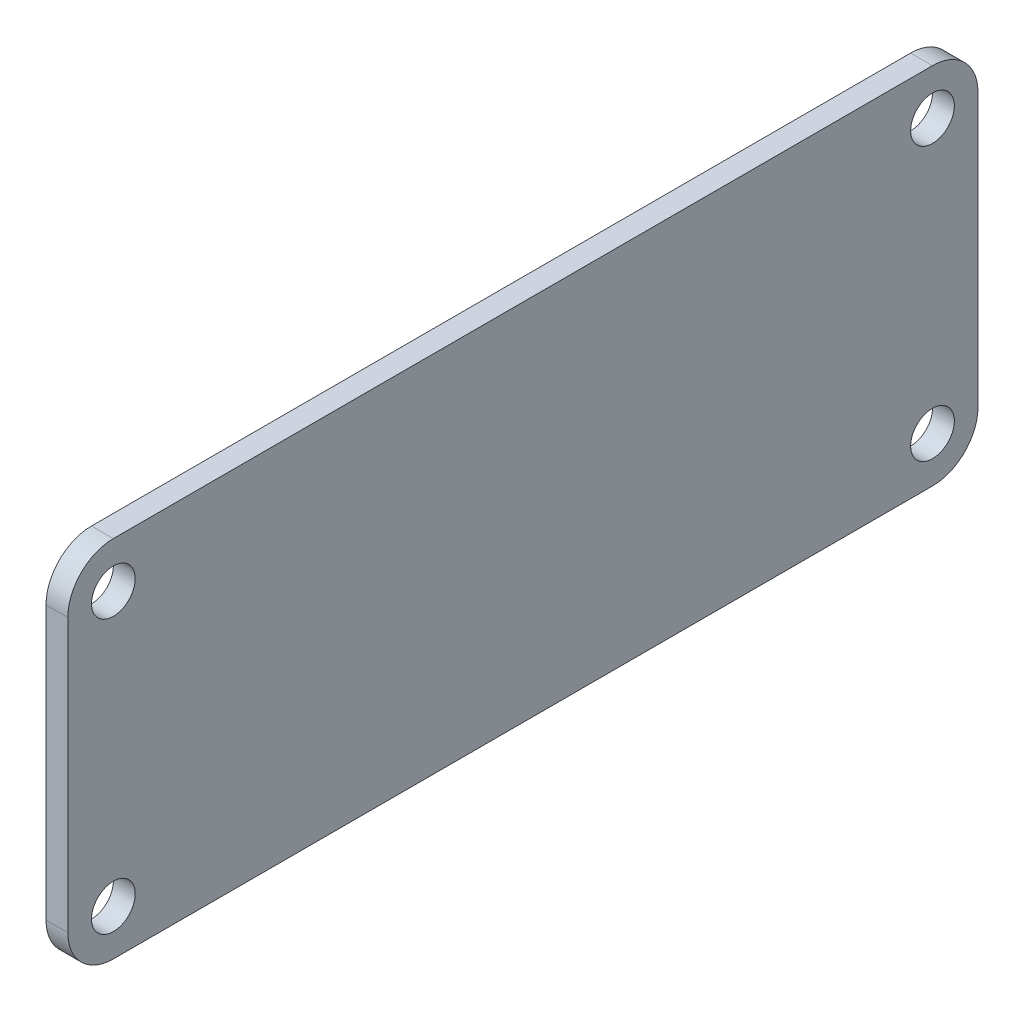
ISO-10303-21;
HEADER;
FILE_DESCRIPTION(('STEP AP214'),'2;1');
FILE_NAME('part.step','',(''),(''),'','','');
FILE_SCHEMA(('AUTOMOTIVE_DESIGN { 1 0 10303 214 1 1 1 1 }'));
ENDSEC;
DATA;
#1=APPLICATION_CONTEXT('core data for automotive mechanical design processes');
#2=APPLICATION_PROTOCOL_DEFINITION('international standard','automotive_design',2000,#1);
#3=PRODUCT_CONTEXT('',#1,'mechanical');
#4=PRODUCT('Part','Part','',(#3));
#5=PRODUCT_RELATED_PRODUCT_CATEGORY('part','',(#4));
#6=PRODUCT_DEFINITION_FORMATION('','',#4);
#7=PRODUCT_DEFINITION_CONTEXT('part definition',#1,'design');
#8=PRODUCT_DEFINITION('design','',#6,#7);
#9=PRODUCT_DEFINITION_SHAPE('','',#8);
#10=(LENGTH_UNIT() NAMED_UNIT(*) SI_UNIT(.MILLI.,.METRE.));
#11=(NAMED_UNIT(*) PLANE_ANGLE_UNIT() SI_UNIT($,.RADIAN.));
#12=(NAMED_UNIT(*) SI_UNIT($,.STERADIAN.) SOLID_ANGLE_UNIT());
#13=UNCERTAINTY_MEASURE_WITH_UNIT(LENGTH_MEASURE(1.E-05),#10,'distance_accuracy_value','');
#14=(GEOMETRIC_REPRESENTATION_CONTEXT(3) GLOBAL_UNCERTAINTY_ASSIGNED_CONTEXT((#13)) GLOBAL_UNIT_ASSIGNED_CONTEXT((#10,
#11,#12)) REPRESENTATION_CONTEXT('',''));
#15=CARTESIAN_POINT('',(0.,0.,0.));
#16=DIRECTION('',(0.,0.,1.));
#17=DIRECTION('',(1.,0.,0.));
#18=AXIS2_PLACEMENT_3D('',#15,#16,#17);
#19=CARTESIAN_POINT('',(1.524,-9.525,28.575));
#20=DIRECTION('',(-1.,0.,0.));
#21=DIRECTION('',(0.,0.,1.));
#22=AXIS2_PLACEMENT_3D('',#19,#20,#21);
#23=PLANE('',#22);
#24=CARTESIAN_POINT('',(1.524,-9.525,-28.575));
#25=DIRECTION('',(1.,0.,0.));
#26=DIRECTION('',(0.,0.,-1.));
#27=AXIS2_PLACEMENT_3D('',#24,#25,#26);
#28=CIRCLE('',#27,1.524);
#29=CARTESIAN_POINT('',(1.524,-9.525,-27.051));
#30=VERTEX_POINT('',#29);
#31=EDGE_CURVE('E188',#30,#30,#28,.T.);
#32=ORIENTED_EDGE('',*,*,#31,.F.);
#33=EDGE_LOOP('',(#32));
#34=FACE_BOUND('',#33,.T.);
#35=CARTESIAN_POINT('',(1.524,9.525,28.575));
#36=DIRECTION('',(1.,0.,0.));
#37=DIRECTION('',(0.,0.,-1.));
#38=AXIS2_PLACEMENT_3D('',#35,#36,#37);
#39=CIRCLE('',#38,1.524);
#40=CARTESIAN_POINT('',(1.524,9.525,30.099));
#41=VERTEX_POINT('',#40);
#42=EDGE_CURVE('E134',#41,#41,#39,.T.);
#43=ORIENTED_EDGE('',*,*,#42,.F.);
#44=EDGE_LOOP('',(#43));
#45=FACE_BOUND('',#44,.T.);
#46=CARTESIAN_POINT('',(1.524,-9.525,28.575));
#47=DIRECTION('',(1.,0.,0.));
#48=DIRECTION('',(0.,0.,1.));
#49=AXIS2_PLACEMENT_3D('',#46,#47,#48);
#50=CIRCLE('',#49,3.175);
#51=CARTESIAN_POINT('',(1.524,-9.52499999999998,31.75));
#52=VERTEX_POINT('',#51);
#53=CARTESIAN_POINT('',(1.524,-12.7,28.575));
#54=VERTEX_POINT('',#53);
#55=EDGE_CURVE('E145',#52,#54,#50,.T.);
#56=ORIENTED_EDGE('',*,*,#55,.T.);
#57=DIRECTION('',(0.,0.,-1.));
#58=VECTOR('',#57,1.);
#59=CARTESIAN_POINT('',(1.524,-12.7,28.575));
#60=LINE('',#59,#58);
#61=CARTESIAN_POINT('',(1.524,-12.7,-28.575));
#62=VERTEX_POINT('',#61);
#63=EDGE_CURVE('E93',#54,#62,#60,.T.);
#64=ORIENTED_EDGE('',*,*,#63,.T.);
#65=CARTESIAN_POINT('',(1.524,-9.525,-28.575));
#66=DIRECTION('',(1.,0.,0.));
#67=DIRECTION('',(0.,0.,-1.));
#68=AXIS2_PLACEMENT_3D('',#65,#66,#67);
#69=CIRCLE('',#68,3.175);
#70=CARTESIAN_POINT('',(1.524,-9.52499999999998,-31.75));
#71=VERTEX_POINT('',#70);
#72=EDGE_CURVE('E160',#62,#71,#69,.T.);
#73=ORIENTED_EDGE('',*,*,#72,.T.);
#74=DIRECTION('',(0.,1.,0.));
#75=VECTOR('',#74,1.);
#76=CARTESIAN_POINT('',(1.524,-9.52499999999998,-31.75));
#77=LINE('',#76,#75);
#78=CARTESIAN_POINT('',(1.524,9.52499999999997,-31.75));
#79=VERTEX_POINT('',#78);
#80=EDGE_CURVE('E173',#71,#79,#77,.T.);
#81=ORIENTED_EDGE('',*,*,#80,.T.);
#82=CARTESIAN_POINT('',(1.524,9.525,-28.575));
#83=DIRECTION('',(1.,0.,0.));
#84=DIRECTION('',(0.,0.,1.));
#85=AXIS2_PLACEMENT_3D('',#82,#83,#84);
#86=CIRCLE('',#85,3.175);
#87=CARTESIAN_POINT('',(1.524,12.7,-28.575));
#88=VERTEX_POINT('',#87);
#89=EDGE_CURVE('E112',#79,#88,#86,.T.);
#90=ORIENTED_EDGE('',*,*,#89,.T.);
#91=DIRECTION('',(0.,0.,1.));
#92=VECTOR('',#91,1.);
#93=CARTESIAN_POINT('',(1.524,12.7,28.575));
#94=LINE('',#93,#92);
#95=CARTESIAN_POINT('',(1.524,12.7,28.575));
#96=VERTEX_POINT('',#95);
#97=EDGE_CURVE('E106',#88,#96,#94,.T.);
#98=ORIENTED_EDGE('',*,*,#97,.T.);
#99=CARTESIAN_POINT('',(1.524,9.525,28.575));
#100=DIRECTION('',(1.,0.,0.));
#101=DIRECTION('',(0.,0.,1.));
#102=AXIS2_PLACEMENT_3D('',#99,#100,#101);
#103=CIRCLE('',#102,3.175);
#104=CARTESIAN_POINT('',(1.524,9.52499999999998,31.75));
#105=VERTEX_POINT('',#104);
#106=EDGE_CURVE('E110',#96,#105,#103,.T.);
#107=ORIENTED_EDGE('',*,*,#106,.T.);
#108=DIRECTION('',(0.,-1.,0.));
#109=VECTOR('',#108,1.);
#110=CARTESIAN_POINT('',(1.524,-9.52499999999998,31.75));
#111=LINE('',#110,#109);
#112=EDGE_CURVE('E50',#105,#52,#111,.T.);
#113=ORIENTED_EDGE('',*,*,#112,.T.);
#114=EDGE_LOOP('',(#56,#64,#73,#81,#90,#98,#107,#113));
#115=FACE_BOUND('',#114,.T.);
#116=CARTESIAN_POINT('',(1.524,9.525,-28.575));
#117=DIRECTION('',(1.,0.,0.));
#118=DIRECTION('',(0.,0.,-1.));
#119=AXIS2_PLACEMENT_3D('',#116,#117,#118);
#120=CIRCLE('',#119,1.524);
#121=CARTESIAN_POINT('',(1.524,9.525,-27.051));
#122=VERTEX_POINT('',#121);
#123=EDGE_CURVE('E182',#122,#122,#120,.T.);
#124=ORIENTED_EDGE('',*,*,#123,.F.);
#125=EDGE_LOOP('',(#124));
#126=FACE_BOUND('',#125,.T.);
#127=CARTESIAN_POINT('',(1.524,-9.525,28.575));
#128=DIRECTION('',(1.,0.,0.));
#129=DIRECTION('',(0.,0.,-1.));
#130=AXIS2_PLACEMENT_3D('',#127,#128,#129);
#131=CIRCLE('',#130,1.524);
#132=CARTESIAN_POINT('',(1.524,-9.525,30.099));
#133=VERTEX_POINT('',#132);
#134=EDGE_CURVE('E194',#133,#133,#131,.T.);
#135=ORIENTED_EDGE('',*,*,#134,.F.);
#136=EDGE_LOOP('',(#135));
#137=FACE_BOUND('',#136,.T.);
#138=ADVANCED_FACE('F33',(#34,#45,#115,#126,#137),#23,.F.);
#139=CARTESIAN_POINT('',(0.,-9.525,28.575));
#140=DIRECTION('',(-1.,0.,0.));
#141=DIRECTION('',(0.,0.,1.));
#142=AXIS2_PLACEMENT_3D('',#139,#140,#141);
#143=PLANE('',#142);
#144=CARTESIAN_POINT('',(0.,-9.525,-28.575));
#145=DIRECTION('',(1.,0.,0.));
#146=DIRECTION('',(0.,0.,-1.));
#147=AXIS2_PLACEMENT_3D('',#144,#145,#146);
#148=CIRCLE('',#147,1.524);
#149=CARTESIAN_POINT('',(0.,-9.525,-27.051));
#150=VERTEX_POINT('',#149);
#151=EDGE_CURVE('E191',#150,#150,#148,.T.);
#152=ORIENTED_EDGE('',*,*,#151,.T.);
#153=EDGE_LOOP('',(#152));
#154=FACE_BOUND('',#153,.T.);
#155=CARTESIAN_POINT('',(0.,9.525,28.575));
#156=DIRECTION('',(1.,0.,0.));
#157=DIRECTION('',(0.,0.,-1.));
#158=AXIS2_PLACEMENT_3D('',#155,#156,#157);
#159=CIRCLE('',#158,1.524);
#160=CARTESIAN_POINT('',(0.,9.525,30.099));
#161=VERTEX_POINT('',#160);
#162=EDGE_CURVE('E179',#161,#161,#159,.T.);
#163=ORIENTED_EDGE('',*,*,#162,.T.);
#164=EDGE_LOOP('',(#163));
#165=FACE_BOUND('',#164,.T.);
#166=CARTESIAN_POINT('',(0.,-9.525,28.575));
#167=DIRECTION('',(1.,0.,0.));
#168=DIRECTION('',(0.,0.,1.));
#169=AXIS2_PLACEMENT_3D('',#166,#167,#168);
#170=CIRCLE('',#169,3.175);
#171=CARTESIAN_POINT('',(0.,-9.52499999999998,31.75));
#172=VERTEX_POINT('',#171);
#173=CARTESIAN_POINT('',(0.,-12.7,28.575));
#174=VERTEX_POINT('',#173);
#175=EDGE_CURVE('E130',#172,#174,#170,.T.);
#176=ORIENTED_EDGE('',*,*,#175,.F.);
#177=DIRECTION('',(0.,-1.,0.));
#178=VECTOR('',#177,1.);
#179=CARTESIAN_POINT('',(0.,-9.52499999999998,31.75));
#180=LINE('',#179,#178);
#181=CARTESIAN_POINT('',(0.,9.52499999999998,31.75));
#182=VERTEX_POINT('',#181);
#183=EDGE_CURVE('E85',#182,#172,#180,.T.);
#184=ORIENTED_EDGE('',*,*,#183,.F.);
#185=CARTESIAN_POINT('',(0.,9.525,28.575));
#186=DIRECTION('',(1.,0.,0.));
#187=DIRECTION('',(0.,0.,1.));
#188=AXIS2_PLACEMENT_3D('',#185,#186,#187);
#189=CIRCLE('',#188,3.175);
#190=CARTESIAN_POINT('',(0.,12.7,28.575));
#191=VERTEX_POINT('',#190);
#192=EDGE_CURVE('E79',#191,#182,#189,.T.);
#193=ORIENTED_EDGE('',*,*,#192,.F.);
#194=DIRECTION('',(0.,0.,1.));
#195=VECTOR('',#194,1.);
#196=CARTESIAN_POINT('',(0.,12.7,28.575));
#197=LINE('',#196,#195);
#198=CARTESIAN_POINT('',(0.,12.7,-28.575));
#199=VERTEX_POINT('',#198);
#200=EDGE_CURVE('E120',#199,#191,#197,.T.);
#201=ORIENTED_EDGE('',*,*,#200,.F.);
#202=CARTESIAN_POINT('',(0.,9.525,-28.575));
#203=DIRECTION('',(1.,0.,0.));
#204=DIRECTION('',(0.,0.,1.));
#205=AXIS2_PLACEMENT_3D('',#202,#203,#204);
#206=CIRCLE('',#205,3.175);
#207=CARTESIAN_POINT('',(0.,9.52499999999997,-31.75));
#208=VERTEX_POINT('',#207);
#209=EDGE_CURVE('E140',#208,#199,#206,.T.);
#210=ORIENTED_EDGE('',*,*,#209,.F.);
#211=DIRECTION('',(0.,1.,0.));
#212=VECTOR('',#211,1.);
#213=CARTESIAN_POINT('',(0.,-9.52499999999998,-31.75));
#214=LINE('',#213,#212);
#215=CARTESIAN_POINT('',(0.,-9.52499999999998,-31.75));
#216=VERTEX_POINT('',#215);
#217=EDGE_CURVE('E138',#216,#208,#214,.T.);
#218=ORIENTED_EDGE('',*,*,#217,.F.);
#219=CARTESIAN_POINT('',(0.,-9.525,-28.575));
#220=DIRECTION('',(1.,0.,0.));
#221=DIRECTION('',(0.,0.,-1.));
#222=AXIS2_PLACEMENT_3D('',#219,#220,#221);
#223=CIRCLE('',#222,3.175);
#224=CARTESIAN_POINT('',(0.,-12.7,-28.575));
#225=VERTEX_POINT('',#224);
#226=EDGE_CURVE('E136',#225,#216,#223,.T.);
#227=ORIENTED_EDGE('',*,*,#226,.F.);
#228=DIRECTION('',(0.,0.,-1.));
#229=VECTOR('',#228,1.);
#230=CARTESIAN_POINT('',(0.,-12.7,28.575));
#231=LINE('',#230,#229);
#232=EDGE_CURVE('E133',#174,#225,#231,.T.);
#233=ORIENTED_EDGE('',*,*,#232,.F.);
#234=EDGE_LOOP('',(#176,#184,#193,#201,#210,#218,#227,#233));
#235=FACE_BOUND('',#234,.T.);
#236=CARTESIAN_POINT('',(0.,9.525,-28.575));
#237=DIRECTION('',(1.,0.,0.));
#238=DIRECTION('',(0.,0.,-1.));
#239=AXIS2_PLACEMENT_3D('',#236,#237,#238);
#240=CIRCLE('',#239,1.524);
#241=CARTESIAN_POINT('',(0.,9.525,-27.051));
#242=VERTEX_POINT('',#241);
#243=EDGE_CURVE('E185',#242,#242,#240,.T.);
#244=ORIENTED_EDGE('',*,*,#243,.T.);
#245=EDGE_LOOP('',(#244));
#246=FACE_BOUND('',#245,.T.);
#247=CARTESIAN_POINT('',(0.,-9.525,28.575));
#248=DIRECTION('',(1.,0.,0.));
#249=DIRECTION('',(0.,0.,-1.));
#250=AXIS2_PLACEMENT_3D('',#247,#248,#249);
#251=CIRCLE('',#250,1.524);
#252=CARTESIAN_POINT('',(0.,-9.525,30.099));
#253=VERTEX_POINT('',#252);
#254=EDGE_CURVE('E197',#253,#253,#251,.T.);
#255=ORIENTED_EDGE('',*,*,#254,.T.);
#256=EDGE_LOOP('',(#255));
#257=FACE_BOUND('',#256,.T.);
#258=ADVANCED_FACE('F164',(#154,#165,#235,#246,#257),#143,.T.);
#259=CARTESIAN_POINT('',(1.524,-9.525,28.575));
#260=DIRECTION('',(-1.,0.,0.));
#261=DIRECTION('',(0.,0.,1.));
#262=AXIS2_PLACEMENT_3D('',#259,#260,#261);
#263=CYLINDRICAL_SURFACE('',#262,3.175);
#264=ORIENTED_EDGE('',*,*,#175,.T.);
#265=DIRECTION('',(-1.,0.,0.));
#266=VECTOR('',#265,1.);
#267=CARTESIAN_POINT('',(1.524,-12.7,28.575));
#268=LINE('',#267,#266);
#269=EDGE_CURVE('E11',#54,#174,#268,.T.);
#270=ORIENTED_EDGE('',*,*,#269,.F.);
#271=ORIENTED_EDGE('',*,*,#55,.F.);
#272=DIRECTION('',(-1.,0.,0.));
#273=VECTOR('',#272,1.);
#274=CARTESIAN_POINT('',(1.524,-9.52499999999998,31.75));
#275=LINE('',#274,#273);
#276=EDGE_CURVE('E126',#52,#172,#275,.T.);
#277=ORIENTED_EDGE('',*,*,#276,.T.);
#278=EDGE_LOOP('',(#264,#270,#271,#277));
#279=FACE_BOUND('',#278,.T.);
#280=ADVANCED_FACE('F35',(#279),#263,.T.);
#281=CARTESIAN_POINT('',(1.524,-12.7,28.575));
#282=DIRECTION('',(0.,1.,0.));
#283=DIRECTION('',(0.,0.,1.));
#284=AXIS2_PLACEMENT_3D('',#281,#282,#283);
#285=PLANE('',#284);
#286=ORIENTED_EDGE('',*,*,#232,.T.);
#287=DIRECTION('',(-1.,0.,0.));
#288=VECTOR('',#287,1.);
#289=CARTESIAN_POINT('',(1.524,-12.7,-28.575));
#290=LINE('',#289,#288);
#291=EDGE_CURVE('E42',#62,#225,#290,.T.);
#292=ORIENTED_EDGE('',*,*,#291,.F.);
#293=ORIENTED_EDGE('',*,*,#63,.F.);
#294=ORIENTED_EDGE('',*,*,#269,.T.);
#295=EDGE_LOOP('',(#286,#292,#293,#294));
#296=FACE_BOUND('',#295,.T.);
#297=ADVANCED_FACE('F232',(#296),#285,.F.);
#298=CARTESIAN_POINT('',(1.524,-9.525,-28.575));
#299=DIRECTION('',(-1.,0.,0.));
#300=DIRECTION('',(0.,0.,1.));
#301=AXIS2_PLACEMENT_3D('',#298,#299,#300);
#302=CYLINDRICAL_SURFACE('',#301,3.175);
#303=ORIENTED_EDGE('',*,*,#226,.T.);
#304=DIRECTION('',(-1.,0.,0.));
#305=VECTOR('',#304,1.);
#306=CARTESIAN_POINT('',(1.524,-9.52499999999998,-31.75));
#307=LINE('',#306,#305);
#308=EDGE_CURVE('E152',#71,#216,#307,.T.);
#309=ORIENTED_EDGE('',*,*,#308,.F.);
#310=ORIENTED_EDGE('',*,*,#72,.F.);
#311=ORIENTED_EDGE('',*,*,#291,.T.);
#312=EDGE_LOOP('',(#303,#309,#310,#311));
#313=FACE_BOUND('',#312,.T.);
#314=ADVANCED_FACE('F158',(#313),#302,.T.);
#315=CARTESIAN_POINT('',(1.524,-9.52499999999998,-31.75));
#316=DIRECTION('',(0.,0.,1.));
#317=DIRECTION('',(1.,0.,0.));
#318=AXIS2_PLACEMENT_3D('',#315,#316,#317);
#319=PLANE('',#318);
#320=ORIENTED_EDGE('',*,*,#217,.T.);
#321=DIRECTION('',(-1.,0.,0.));
#322=VECTOR('',#321,1.);
#323=CARTESIAN_POINT('',(1.524,9.52499999999997,-31.75));
#324=LINE('',#323,#322);
#325=EDGE_CURVE('E149',#79,#208,#324,.T.);
#326=ORIENTED_EDGE('',*,*,#325,.F.);
#327=ORIENTED_EDGE('',*,*,#80,.F.);
#328=ORIENTED_EDGE('',*,*,#308,.T.);
#329=EDGE_LOOP('',(#320,#326,#327,#328));
#330=FACE_BOUND('',#329,.T.);
#331=ADVANCED_FACE('F169',(#330),#319,.F.);
#332=CARTESIAN_POINT('',(1.524,9.525,-28.575));
#333=DIRECTION('',(-1.,0.,0.));
#334=DIRECTION('',(0.,0.,1.));
#335=AXIS2_PLACEMENT_3D('',#332,#333,#334);
#336=CYLINDRICAL_SURFACE('',#335,3.175);
#337=ORIENTED_EDGE('',*,*,#209,.T.);
#338=DIRECTION('',(-1.,0.,0.));
#339=VECTOR('',#338,1.);
#340=CARTESIAN_POINT('',(1.524,12.7,-28.575));
#341=LINE('',#340,#339);
#342=EDGE_CURVE('E121',#88,#199,#341,.T.);
#343=ORIENTED_EDGE('',*,*,#342,.F.);
#344=ORIENTED_EDGE('',*,*,#89,.F.);
#345=ORIENTED_EDGE('',*,*,#325,.T.);
#346=EDGE_LOOP('',(#337,#343,#344,#345));
#347=FACE_BOUND('',#346,.T.);
#348=ADVANCED_FACE('F172',(#347),#336,.T.);
#349=CARTESIAN_POINT('',(1.524,12.7,28.575));
#350=DIRECTION('',(0.,-1.,0.));
#351=DIRECTION('',(0.,0.,-1.));
#352=AXIS2_PLACEMENT_3D('',#349,#350,#351);
#353=PLANE('',#352);
#354=ORIENTED_EDGE('',*,*,#200,.T.);
#355=DIRECTION('',(-1.,0.,0.));
#356=VECTOR('',#355,1.);
#357=CARTESIAN_POINT('',(1.524,12.7,28.575));
#358=LINE('',#357,#356);
#359=EDGE_CURVE('E117',#96,#191,#358,.T.);
#360=ORIENTED_EDGE('',*,*,#359,.F.);
#361=ORIENTED_EDGE('',*,*,#97,.F.);
#362=ORIENTED_EDGE('',*,*,#342,.T.);
#363=EDGE_LOOP('',(#354,#360,#361,#362));
#364=FACE_BOUND('',#363,.T.);
#365=ADVANCED_FACE('F118',(#364),#353,.F.);
#366=CARTESIAN_POINT('',(1.524,9.525,28.575));
#367=DIRECTION('',(-1.,0.,0.));
#368=DIRECTION('',(0.,0.,1.));
#369=AXIS2_PLACEMENT_3D('',#366,#367,#368);
#370=CYLINDRICAL_SURFACE('',#369,3.175);
#371=ORIENTED_EDGE('',*,*,#192,.T.);
#372=DIRECTION('',(-1.,0.,0.));
#373=VECTOR('',#372,1.);
#374=CARTESIAN_POINT('',(1.524,9.52499999999998,31.75));
#375=LINE('',#374,#373);
#376=EDGE_CURVE('E122',#105,#182,#375,.T.);
#377=ORIENTED_EDGE('',*,*,#376,.F.);
#378=ORIENTED_EDGE('',*,*,#106,.F.);
#379=ORIENTED_EDGE('',*,*,#359,.T.);
#380=EDGE_LOOP('',(#371,#377,#378,#379));
#381=FACE_BOUND('',#380,.T.);
#382=ADVANCED_FACE('F124',(#381),#370,.T.);
#383=CARTESIAN_POINT('',(1.524,-9.52499999999998,31.75));
#384=DIRECTION('',(0.,0.,-1.));
#385=DIRECTION('',(-1.,0.,0.));
#386=AXIS2_PLACEMENT_3D('',#383,#384,#385);
#387=PLANE('',#386);
#388=ORIENTED_EDGE('',*,*,#183,.T.);
#389=ORIENTED_EDGE('',*,*,#276,.F.);
#390=ORIENTED_EDGE('',*,*,#112,.F.);
#391=ORIENTED_EDGE('',*,*,#376,.T.);
#392=EDGE_LOOP('',(#388,#389,#390,#391));
#393=FACE_BOUND('',#392,.T.);
#394=ADVANCED_FACE('F220',(#393),#387,.F.);
#395=CARTESIAN_POINT('',(1.524,9.525,28.575));
#396=DIRECTION('',(-1.,0.,0.));
#397=DIRECTION('',(0.,0.,1.));
#398=AXIS2_PLACEMENT_3D('',#395,#396,#397);
#399=CYLINDRICAL_SURFACE('',#398,1.524);
#400=CARTESIAN_POINT('',(1.524,9.525,30.099));
#401=CARTESIAN_POINT('',(1.508125,9.525,30.099));
#402=CARTESIAN_POINT('',(1.49225,9.525,30.099));
#403=CARTESIAN_POINT('',(1.4605,9.525,30.099));
#404=CARTESIAN_POINT('',(1.444625,9.525,30.099));
#405=CARTESIAN_POINT('',(1.412875,9.525,30.099));
#406=CARTESIAN_POINT('',(1.397,9.525,30.099));
#407=CARTESIAN_POINT('',(1.36525,9.525,30.099));
#408=CARTESIAN_POINT('',(1.349375,9.525,30.099));
#409=CARTESIAN_POINT('',(1.317625,9.525,30.099));
#410=CARTESIAN_POINT('',(1.30175,9.525,30.099));
#411=CARTESIAN_POINT('',(1.27,9.525,30.099));
#412=CARTESIAN_POINT('',(1.254125,9.525,30.099));
#413=CARTESIAN_POINT('',(1.222375,9.525,30.099));
#414=CARTESIAN_POINT('',(1.2065,9.525,30.099));
#415=CARTESIAN_POINT('',(1.17475,9.525,30.099));
#416=CARTESIAN_POINT('',(1.158875,9.525,30.099));
#417=CARTESIAN_POINT('',(1.127125,9.525,30.099));
#418=CARTESIAN_POINT('',(1.11125,9.525,30.099));
#419=CARTESIAN_POINT('',(1.0795,9.525,30.099));
#420=CARTESIAN_POINT('',(1.063625,9.525,30.099));
#421=CARTESIAN_POINT('',(1.031875,9.525,30.099));
#422=CARTESIAN_POINT('',(1.016,9.525,30.099));
#423=CARTESIAN_POINT('',(0.98425,9.525,30.099));
#424=CARTESIAN_POINT('',(0.968375,9.525,30.099));
#425=CARTESIAN_POINT('',(0.936625,9.525,30.099));
#426=CARTESIAN_POINT('',(0.92075,9.525,30.099));
#427=CARTESIAN_POINT('',(0.889,9.525,30.099));
#428=CARTESIAN_POINT('',(0.873125,9.525,30.099));
#429=CARTESIAN_POINT('',(0.841375,9.525,30.099));
#430=CARTESIAN_POINT('',(0.8255,9.525,30.099));
#431=CARTESIAN_POINT('',(0.79375,9.525,30.099));
#432=CARTESIAN_POINT('',(0.777875,9.525,30.099));
#433=CARTESIAN_POINT('',(0.746125,9.525,30.099));
#434=CARTESIAN_POINT('',(0.73025,9.525,30.099));
#435=CARTESIAN_POINT('',(0.6985,9.525,30.099));
#436=CARTESIAN_POINT('',(0.682625,9.525,30.099));
#437=CARTESIAN_POINT('',(0.650875,9.525,30.099));
#438=CARTESIAN_POINT('',(0.635,9.525,30.099));
#439=CARTESIAN_POINT('',(0.60325,9.525,30.099));
#440=CARTESIAN_POINT('',(0.587375,9.525,30.099));
#441=CARTESIAN_POINT('',(0.555625,9.525,30.099));
#442=CARTESIAN_POINT('',(0.53975,9.525,30.099));
#443=CARTESIAN_POINT('',(0.508,9.525,30.099));
#444=CARTESIAN_POINT('',(0.492125,9.525,30.099));
#445=CARTESIAN_POINT('',(0.460375,9.525,30.099));
#446=CARTESIAN_POINT('',(0.4445,9.525,30.099));
#447=CARTESIAN_POINT('',(0.41275,9.525,30.099));
#448=CARTESIAN_POINT('',(0.396875,9.525,30.099));
#449=CARTESIAN_POINT('',(0.365125,9.525,30.099));
#450=CARTESIAN_POINT('',(0.34925,9.525,30.099));
#451=CARTESIAN_POINT('',(0.3175,9.525,30.099));
#452=CARTESIAN_POINT('',(0.301625,9.525,30.099));
#453=CARTESIAN_POINT('',(0.269875,9.525,30.099));
#454=CARTESIAN_POINT('',(0.254,9.525,30.099));
#455=CARTESIAN_POINT('',(0.22225,9.525,30.099));
#456=CARTESIAN_POINT('',(0.206375,9.525,30.099));
#457=CARTESIAN_POINT('',(0.174625,9.525,30.099));
#458=CARTESIAN_POINT('',(0.15875,9.525,30.099));
#459=CARTESIAN_POINT('',(0.127,9.525,30.099));
#460=CARTESIAN_POINT('',(0.111125,9.525,30.099));
#461=CARTESIAN_POINT('',(0.079375,9.525,30.099));
#462=CARTESIAN_POINT('',(0.0635,9.525,30.099));
#463=CARTESIAN_POINT('',(0.0317499999999999,9.525,30.099));
#464=CARTESIAN_POINT('',(0.015875,9.525,30.099));
#465=CARTESIAN_POINT('',(0.,9.525,30.099));
#466=B_SPLINE_CURVE_WITH_KNOTS('',3,(#400,#401,#402,#403,#404,#405,#406,#407,#408,#409,#410,
#411,#412,#413,#414,#415,#416,#417,#418,#419,#420,#421,#422,#423,#424,#425,#426,#427,#428,#429,
#430,#431,#432,#433,#434,#435,#436,#437,#438,#439,#440,#441,#442,#443,#444,#445,#446,#447,#448,
#449,#450,#451,#452,#453,#454,#455,#456,#457,#458,#459,#460,#461,#462,#463,#464,#465),
.UNSPECIFIED.,.F.,.F.,(4,2,2,2,2,2,2,2,2,2,2,2,2,2,2,2,2,2,2,2,2,2,2,2,2,2,2,2,2,2,2,2,4),(0.,
0.0476249999999999,0.0952499999999998,0.142875,0.1905,0.238125,0.28575,0.333375,0.381,0.428625,
0.47625,0.523875,0.5715,0.619125,0.66675,0.714375,0.762,0.809625,0.85725,0.904875,0.9525,
1.000125,1.04775,1.095375,1.143,1.190625,1.23825,1.285875,1.3335,1.381125,1.42875,1.476375,
1.524),.UNSPECIFIED.);
#467=EDGE_CURVE('BSEAM217',#41,#161,#466,.T.);
#468=ORIENTED_EDGE('',*,*,#42,.T.);
#469=ORIENTED_EDGE('',*,*,#162,.F.);
#470=ORIENTED_EDGE('',*,*,#467,.T.);
#471=ORIENTED_EDGE('',*,*,#467,.F.);
#472=EDGE_LOOP('',(#468,#470,#469,#471));
#473=FACE_BOUND('',#472,.T.);
#474=ADVANCED_FACE('F217',(#473),#399,.F.);
#475=CARTESIAN_POINT('',(1.524,9.525,-28.575));
#476=DIRECTION('',(-1.,0.,0.));
#477=DIRECTION('',(0.,0.,1.));
#478=AXIS2_PLACEMENT_3D('',#475,#476,#477);
#479=CYLINDRICAL_SURFACE('',#478,1.524);
#480=CARTESIAN_POINT('',(1.524,9.525,-27.051));
#481=CARTESIAN_POINT('',(1.508125,9.525,-27.051));
#482=CARTESIAN_POINT('',(1.49225,9.525,-27.051));
#483=CARTESIAN_POINT('',(1.4605,9.525,-27.051));
#484=CARTESIAN_POINT('',(1.444625,9.525,-27.051));
#485=CARTESIAN_POINT('',(1.412875,9.525,-27.051));
#486=CARTESIAN_POINT('',(1.397,9.525,-27.051));
#487=CARTESIAN_POINT('',(1.36525,9.525,-27.051));
#488=CARTESIAN_POINT('',(1.349375,9.525,-27.051));
#489=CARTESIAN_POINT('',(1.317625,9.525,-27.051));
#490=CARTESIAN_POINT('',(1.30175,9.525,-27.051));
#491=CARTESIAN_POINT('',(1.27,9.525,-27.051));
#492=CARTESIAN_POINT('',(1.254125,9.525,-27.051));
#493=CARTESIAN_POINT('',(1.222375,9.525,-27.051));
#494=CARTESIAN_POINT('',(1.2065,9.525,-27.051));
#495=CARTESIAN_POINT('',(1.17475,9.525,-27.051));
#496=CARTESIAN_POINT('',(1.158875,9.525,-27.051));
#497=CARTESIAN_POINT('',(1.127125,9.525,-27.051));
#498=CARTESIAN_POINT('',(1.11125,9.525,-27.051));
#499=CARTESIAN_POINT('',(1.0795,9.525,-27.051));
#500=CARTESIAN_POINT('',(1.063625,9.525,-27.051));
#501=CARTESIAN_POINT('',(1.031875,9.525,-27.051));
#502=CARTESIAN_POINT('',(1.016,9.525,-27.051));
#503=CARTESIAN_POINT('',(0.98425,9.525,-27.051));
#504=CARTESIAN_POINT('',(0.968375,9.525,-27.051));
#505=CARTESIAN_POINT('',(0.936625,9.525,-27.051));
#506=CARTESIAN_POINT('',(0.92075,9.525,-27.051));
#507=CARTESIAN_POINT('',(0.889,9.525,-27.051));
#508=CARTESIAN_POINT('',(0.873125,9.525,-27.051));
#509=CARTESIAN_POINT('',(0.841375,9.525,-27.051));
#510=CARTESIAN_POINT('',(0.8255,9.525,-27.051));
#511=CARTESIAN_POINT('',(0.79375,9.525,-27.051));
#512=CARTESIAN_POINT('',(0.777875,9.525,-27.051));
#513=CARTESIAN_POINT('',(0.746125,9.525,-27.051));
#514=CARTESIAN_POINT('',(0.73025,9.525,-27.051));
#515=CARTESIAN_POINT('',(0.6985,9.525,-27.051));
#516=CARTESIAN_POINT('',(0.682625,9.525,-27.051));
#517=CARTESIAN_POINT('',(0.650875,9.525,-27.051));
#518=CARTESIAN_POINT('',(0.635,9.525,-27.051));
#519=CARTESIAN_POINT('',(0.60325,9.525,-27.051));
#520=CARTESIAN_POINT('',(0.587375,9.525,-27.051));
#521=CARTESIAN_POINT('',(0.555625,9.525,-27.051));
#522=CARTESIAN_POINT('',(0.53975,9.525,-27.051));
#523=CARTESIAN_POINT('',(0.508,9.525,-27.051));
#524=CARTESIAN_POINT('',(0.492125,9.525,-27.051));
#525=CARTESIAN_POINT('',(0.460375,9.525,-27.051));
#526=CARTESIAN_POINT('',(0.4445,9.525,-27.051));
#527=CARTESIAN_POINT('',(0.41275,9.525,-27.051));
#528=CARTESIAN_POINT('',(0.396875,9.525,-27.051));
#529=CARTESIAN_POINT('',(0.365125,9.525,-27.051));
#530=CARTESIAN_POINT('',(0.34925,9.525,-27.051));
#531=CARTESIAN_POINT('',(0.3175,9.525,-27.051));
#532=CARTESIAN_POINT('',(0.301625,9.525,-27.051));
#533=CARTESIAN_POINT('',(0.269875,9.525,-27.051));
#534=CARTESIAN_POINT('',(0.254,9.525,-27.051));
#535=CARTESIAN_POINT('',(0.22225,9.525,-27.051));
#536=CARTESIAN_POINT('',(0.206375,9.525,-27.051));
#537=CARTESIAN_POINT('',(0.174625,9.525,-27.051));
#538=CARTESIAN_POINT('',(0.15875,9.525,-27.051));
#539=CARTESIAN_POINT('',(0.127,9.525,-27.051));
#540=CARTESIAN_POINT('',(0.111125,9.525,-27.051));
#541=CARTESIAN_POINT('',(0.079375,9.525,-27.051));
#542=CARTESIAN_POINT('',(0.0635,9.525,-27.051));
#543=CARTESIAN_POINT('',(0.0317499999999999,9.525,-27.051));
#544=CARTESIAN_POINT('',(0.015875,9.525,-27.051));
#545=CARTESIAN_POINT('',(0.,9.525,-27.051));
#546=B_SPLINE_CURVE_WITH_KNOTS('',3,(#480,#481,#482,#483,#484,#485,#486,#487,#488,#489,#490,
#491,#492,#493,#494,#495,#496,#497,#498,#499,#500,#501,#502,#503,#504,#505,#506,#507,#508,#509,
#510,#511,#512,#513,#514,#515,#516,#517,#518,#519,#520,#521,#522,#523,#524,#525,#526,#527,#528,
#529,#530,#531,#532,#533,#534,#535,#536,#537,#538,#539,#540,#541,#542,#543,#544,#545),
.UNSPECIFIED.,.F.,.F.,(4,2,2,2,2,2,2,2,2,2,2,2,2,2,2,2,2,2,2,2,2,2,2,2,2,2,2,2,2,2,2,2,4),(0.,
0.0476249999999999,0.0952499999999998,0.142875,0.1905,0.238125,0.28575,0.333375,0.381,0.428625,
0.47625,0.523875,0.5715,0.619125,0.66675,0.714375,0.762,0.809625,0.85725,0.904875,0.9525,
1.000125,1.04775,1.095375,1.143,1.190625,1.23825,1.285875,1.3335,1.381125,1.42875,1.476375,
1.524),.UNSPECIFIED.);
#547=EDGE_CURVE('BSEAM296',#122,#242,#546,.T.);
#548=ORIENTED_EDGE('',*,*,#123,.T.);
#549=ORIENTED_EDGE('',*,*,#243,.F.);
#550=ORIENTED_EDGE('',*,*,#547,.T.);
#551=ORIENTED_EDGE('',*,*,#547,.F.);
#552=EDGE_LOOP('',(#548,#550,#549,#551));
#553=FACE_BOUND('',#552,.T.);
#554=ADVANCED_FACE('F296',(#553),#479,.F.);
#555=CARTESIAN_POINT('',(1.524,-9.525,-28.575));
#556=DIRECTION('',(-1.,0.,0.));
#557=DIRECTION('',(0.,0.,1.));
#558=AXIS2_PLACEMENT_3D('',#555,#556,#557);
#559=CYLINDRICAL_SURFACE('',#558,1.524);
#560=CARTESIAN_POINT('',(1.524,-9.525,-27.051));
#561=CARTESIAN_POINT('',(1.508125,-9.525,-27.051));
#562=CARTESIAN_POINT('',(1.49225,-9.525,-27.051));
#563=CARTESIAN_POINT('',(1.4605,-9.525,-27.051));
#564=CARTESIAN_POINT('',(1.444625,-9.525,-27.051));
#565=CARTESIAN_POINT('',(1.412875,-9.525,-27.051));
#566=CARTESIAN_POINT('',(1.397,-9.525,-27.051));
#567=CARTESIAN_POINT('',(1.36525,-9.525,-27.051));
#568=CARTESIAN_POINT('',(1.349375,-9.525,-27.051));
#569=CARTESIAN_POINT('',(1.317625,-9.525,-27.051));
#570=CARTESIAN_POINT('',(1.30175,-9.525,-27.051));
#571=CARTESIAN_POINT('',(1.27,-9.525,-27.051));
#572=CARTESIAN_POINT('',(1.254125,-9.525,-27.051));
#573=CARTESIAN_POINT('',(1.222375,-9.525,-27.051));
#574=CARTESIAN_POINT('',(1.2065,-9.525,-27.051));
#575=CARTESIAN_POINT('',(1.17475,-9.525,-27.051));
#576=CARTESIAN_POINT('',(1.158875,-9.525,-27.051));
#577=CARTESIAN_POINT('',(1.127125,-9.525,-27.051));
#578=CARTESIAN_POINT('',(1.11125,-9.525,-27.051));
#579=CARTESIAN_POINT('',(1.0795,-9.525,-27.051));
#580=CARTESIAN_POINT('',(1.063625,-9.525,-27.051));
#581=CARTESIAN_POINT('',(1.031875,-9.525,-27.051));
#582=CARTESIAN_POINT('',(1.016,-9.525,-27.051));
#583=CARTESIAN_POINT('',(0.98425,-9.525,-27.051));
#584=CARTESIAN_POINT('',(0.968375,-9.525,-27.051));
#585=CARTESIAN_POINT('',(0.936625,-9.525,-27.051));
#586=CARTESIAN_POINT('',(0.92075,-9.525,-27.051));
#587=CARTESIAN_POINT('',(0.889,-9.525,-27.051));
#588=CARTESIAN_POINT('',(0.873125,-9.525,-27.051));
#589=CARTESIAN_POINT('',(0.841375,-9.525,-27.051));
#590=CARTESIAN_POINT('',(0.8255,-9.525,-27.051));
#591=CARTESIAN_POINT('',(0.79375,-9.525,-27.051));
#592=CARTESIAN_POINT('',(0.777875,-9.525,-27.051));
#593=CARTESIAN_POINT('',(0.746125,-9.525,-27.051));
#594=CARTESIAN_POINT('',(0.73025,-9.525,-27.051));
#595=CARTESIAN_POINT('',(0.6985,-9.525,-27.051));
#596=CARTESIAN_POINT('',(0.682625,-9.525,-27.051));
#597=CARTESIAN_POINT('',(0.650875,-9.525,-27.051));
#598=CARTESIAN_POINT('',(0.635,-9.525,-27.051));
#599=CARTESIAN_POINT('',(0.60325,-9.525,-27.051));
#600=CARTESIAN_POINT('',(0.587375,-9.525,-27.051));
#601=CARTESIAN_POINT('',(0.555625,-9.525,-27.051));
#602=CARTESIAN_POINT('',(0.53975,-9.525,-27.051));
#603=CARTESIAN_POINT('',(0.508,-9.525,-27.051));
#604=CARTESIAN_POINT('',(0.492125,-9.525,-27.051));
#605=CARTESIAN_POINT('',(0.460375,-9.525,-27.051));
#606=CARTESIAN_POINT('',(0.4445,-9.525,-27.051));
#607=CARTESIAN_POINT('',(0.41275,-9.525,-27.051));
#608=CARTESIAN_POINT('',(0.396875,-9.525,-27.051));
#609=CARTESIAN_POINT('',(0.365125,-9.525,-27.051));
#610=CARTESIAN_POINT('',(0.34925,-9.525,-27.051));
#611=CARTESIAN_POINT('',(0.3175,-9.525,-27.051));
#612=CARTESIAN_POINT('',(0.301625,-9.525,-27.051));
#613=CARTESIAN_POINT('',(0.269875,-9.525,-27.051));
#614=CARTESIAN_POINT('',(0.254,-9.525,-27.051));
#615=CARTESIAN_POINT('',(0.22225,-9.525,-27.051));
#616=CARTESIAN_POINT('',(0.206375,-9.525,-27.051));
#617=CARTESIAN_POINT('',(0.174625,-9.525,-27.051));
#618=CARTESIAN_POINT('',(0.15875,-9.525,-27.051));
#619=CARTESIAN_POINT('',(0.127,-9.525,-27.051));
#620=CARTESIAN_POINT('',(0.111125,-9.525,-27.051));
#621=CARTESIAN_POINT('',(0.079375,-9.525,-27.051));
#622=CARTESIAN_POINT('',(0.0635,-9.525,-27.051));
#623=CARTESIAN_POINT('',(0.0317499999999999,-9.525,-27.051));
#624=CARTESIAN_POINT('',(0.015875,-9.525,-27.051));
#625=CARTESIAN_POINT('',(0.,-9.525,-27.051));
#626=B_SPLINE_CURVE_WITH_KNOTS('',3,(#560,#561,#562,#563,#564,#565,#566,#567,#568,#569,#570,
#571,#572,#573,#574,#575,#576,#577,#578,#579,#580,#581,#582,#583,#584,#585,#586,#587,#588,#589,
#590,#591,#592,#593,#594,#595,#596,#597,#598,#599,#600,#601,#602,#603,#604,#605,#606,#607,#608,
#609,#610,#611,#612,#613,#614,#615,#616,#617,#618,#619,#620,#621,#622,#623,#624,#625),
.UNSPECIFIED.,.F.,.F.,(4,2,2,2,2,2,2,2,2,2,2,2,2,2,2,2,2,2,2,2,2,2,2,2,2,2,2,2,2,2,2,2,4),(0.,
0.0476249999999999,0.0952499999999998,0.142875,0.1905,0.238125,0.28575,0.333375,0.381,0.428625,
0.47625,0.523875,0.5715,0.619125,0.66675,0.714375,0.762,0.809625,0.85725,0.904875,0.9525,
1.000125,1.04775,1.095375,1.143,1.190625,1.23825,1.285875,1.3335,1.381125,1.42875,1.476375,
1.524),.UNSPECIFIED.);
#627=EDGE_CURVE('BSEAM304',#30,#150,#626,.T.);
#628=ORIENTED_EDGE('',*,*,#31,.T.);
#629=ORIENTED_EDGE('',*,*,#151,.F.);
#630=ORIENTED_EDGE('',*,*,#627,.T.);
#631=ORIENTED_EDGE('',*,*,#627,.F.);
#632=EDGE_LOOP('',(#628,#630,#629,#631));
#633=FACE_BOUND('',#632,.T.);
#634=ADVANCED_FACE('F304',(#633),#559,.F.);
#635=CARTESIAN_POINT('',(1.524,-9.525,28.575));
#636=DIRECTION('',(-1.,0.,0.));
#637=DIRECTION('',(0.,0.,1.));
#638=AXIS2_PLACEMENT_3D('',#635,#636,#637);
#639=CYLINDRICAL_SURFACE('',#638,1.524);
#640=CARTESIAN_POINT('',(1.524,-9.525,30.099));
#641=CARTESIAN_POINT('',(1.508125,-9.525,30.099));
#642=CARTESIAN_POINT('',(1.49225,-9.525,30.099));
#643=CARTESIAN_POINT('',(1.4605,-9.525,30.099));
#644=CARTESIAN_POINT('',(1.444625,-9.525,30.099));
#645=CARTESIAN_POINT('',(1.412875,-9.525,30.099));
#646=CARTESIAN_POINT('',(1.397,-9.525,30.099));
#647=CARTESIAN_POINT('',(1.36525,-9.525,30.099));
#648=CARTESIAN_POINT('',(1.349375,-9.525,30.099));
#649=CARTESIAN_POINT('',(1.317625,-9.525,30.099));
#650=CARTESIAN_POINT('',(1.30175,-9.525,30.099));
#651=CARTESIAN_POINT('',(1.27,-9.525,30.099));
#652=CARTESIAN_POINT('',(1.254125,-9.525,30.099));
#653=CARTESIAN_POINT('',(1.222375,-9.525,30.099));
#654=CARTESIAN_POINT('',(1.2065,-9.525,30.099));
#655=CARTESIAN_POINT('',(1.17475,-9.525,30.099));
#656=CARTESIAN_POINT('',(1.158875,-9.525,30.099));
#657=CARTESIAN_POINT('',(1.127125,-9.525,30.099));
#658=CARTESIAN_POINT('',(1.11125,-9.525,30.099));
#659=CARTESIAN_POINT('',(1.0795,-9.525,30.099));
#660=CARTESIAN_POINT('',(1.063625,-9.525,30.099));
#661=CARTESIAN_POINT('',(1.031875,-9.525,30.099));
#662=CARTESIAN_POINT('',(1.016,-9.525,30.099));
#663=CARTESIAN_POINT('',(0.98425,-9.525,30.099));
#664=CARTESIAN_POINT('',(0.968375,-9.525,30.099));
#665=CARTESIAN_POINT('',(0.936625,-9.525,30.099));
#666=CARTESIAN_POINT('',(0.92075,-9.525,30.099));
#667=CARTESIAN_POINT('',(0.889,-9.525,30.099));
#668=CARTESIAN_POINT('',(0.873125,-9.525,30.099));
#669=CARTESIAN_POINT('',(0.841375,-9.525,30.099));
#670=CARTESIAN_POINT('',(0.8255,-9.525,30.099));
#671=CARTESIAN_POINT('',(0.79375,-9.525,30.099));
#672=CARTESIAN_POINT('',(0.777875,-9.525,30.099));
#673=CARTESIAN_POINT('',(0.746125,-9.525,30.099));
#674=CARTESIAN_POINT('',(0.73025,-9.525,30.099));
#675=CARTESIAN_POINT('',(0.6985,-9.525,30.099));
#676=CARTESIAN_POINT('',(0.682625,-9.525,30.099));
#677=CARTESIAN_POINT('',(0.650875,-9.525,30.099));
#678=CARTESIAN_POINT('',(0.635,-9.525,30.099));
#679=CARTESIAN_POINT('',(0.60325,-9.525,30.099));
#680=CARTESIAN_POINT('',(0.587375,-9.525,30.099));
#681=CARTESIAN_POINT('',(0.555625,-9.525,30.099));
#682=CARTESIAN_POINT('',(0.53975,-9.525,30.099));
#683=CARTESIAN_POINT('',(0.508,-9.525,30.099));
#684=CARTESIAN_POINT('',(0.492125,-9.525,30.099));
#685=CARTESIAN_POINT('',(0.460375,-9.525,30.099));
#686=CARTESIAN_POINT('',(0.4445,-9.525,30.099));
#687=CARTESIAN_POINT('',(0.41275,-9.525,30.099));
#688=CARTESIAN_POINT('',(0.396875,-9.525,30.099));
#689=CARTESIAN_POINT('',(0.365125,-9.525,30.099));
#690=CARTESIAN_POINT('',(0.34925,-9.525,30.099));
#691=CARTESIAN_POINT('',(0.3175,-9.525,30.099));
#692=CARTESIAN_POINT('',(0.301625,-9.525,30.099));
#693=CARTESIAN_POINT('',(0.269875,-9.525,30.099));
#694=CARTESIAN_POINT('',(0.254,-9.525,30.099));
#695=CARTESIAN_POINT('',(0.22225,-9.525,30.099));
#696=CARTESIAN_POINT('',(0.206375,-9.525,30.099));
#697=CARTESIAN_POINT('',(0.174625,-9.525,30.099));
#698=CARTESIAN_POINT('',(0.15875,-9.525,30.099));
#699=CARTESIAN_POINT('',(0.127,-9.525,30.099));
#700=CARTESIAN_POINT('',(0.111125,-9.525,30.099));
#701=CARTESIAN_POINT('',(0.079375,-9.525,30.099));
#702=CARTESIAN_POINT('',(0.0635,-9.525,30.099));
#703=CARTESIAN_POINT('',(0.0317499999999999,-9.525,30.099));
#704=CARTESIAN_POINT('',(0.015875,-9.525,30.099));
#705=CARTESIAN_POINT('',(0.,-9.525,30.099));
#706=B_SPLINE_CURVE_WITH_KNOTS('',3,(#640,#641,#642,#643,#644,#645,#646,#647,#648,#649,#650,
#651,#652,#653,#654,#655,#656,#657,#658,#659,#660,#661,#662,#663,#664,#665,#666,#667,#668,#669,
#670,#671,#672,#673,#674,#675,#676,#677,#678,#679,#680,#681,#682,#683,#684,#685,#686,#687,#688,
#689,#690,#691,#692,#693,#694,#695,#696,#697,#698,#699,#700,#701,#702,#703,#704,#705),
.UNSPECIFIED.,.F.,.F.,(4,2,2,2,2,2,2,2,2,2,2,2,2,2,2,2,2,2,2,2,2,2,2,2,2,2,2,2,2,2,2,2,4),(0.,
0.0476249999999999,0.0952499999999998,0.142875,0.1905,0.238125,0.28575,0.333375,0.381,0.428625,
0.47625,0.523875,0.5715,0.619125,0.66675,0.714375,0.762,0.809625,0.85725,0.904875,0.9525,
1.000125,1.04775,1.095375,1.143,1.190625,1.23825,1.285875,1.3335,1.381125,1.42875,1.476375,
1.524),.UNSPECIFIED.);
#707=EDGE_CURVE('BSEAM203',#133,#253,#706,.T.);
#708=ORIENTED_EDGE('',*,*,#134,.T.);
#709=ORIENTED_EDGE('',*,*,#254,.F.);
#710=ORIENTED_EDGE('',*,*,#707,.T.);
#711=ORIENTED_EDGE('',*,*,#707,.F.);
#712=EDGE_LOOP('',(#708,#710,#709,#711));
#713=FACE_BOUND('',#712,.T.);
#714=ADVANCED_FACE('F203',(#713),#639,.F.);
#715=CLOSED_SHELL('',(#138,#258,#280,#297,#314,#331,#348,#365,#382,#394,#474,#554,#634,#714));
#716=MANIFOLD_SOLID_BREP('B2',#715);
#717=ADVANCED_BREP_SHAPE_REPRESENTATION('',(#18,#716),#14);
#718=SHAPE_DEFINITION_REPRESENTATION(#9,#717);
ENDSEC;
END-ISO-10303-21;
